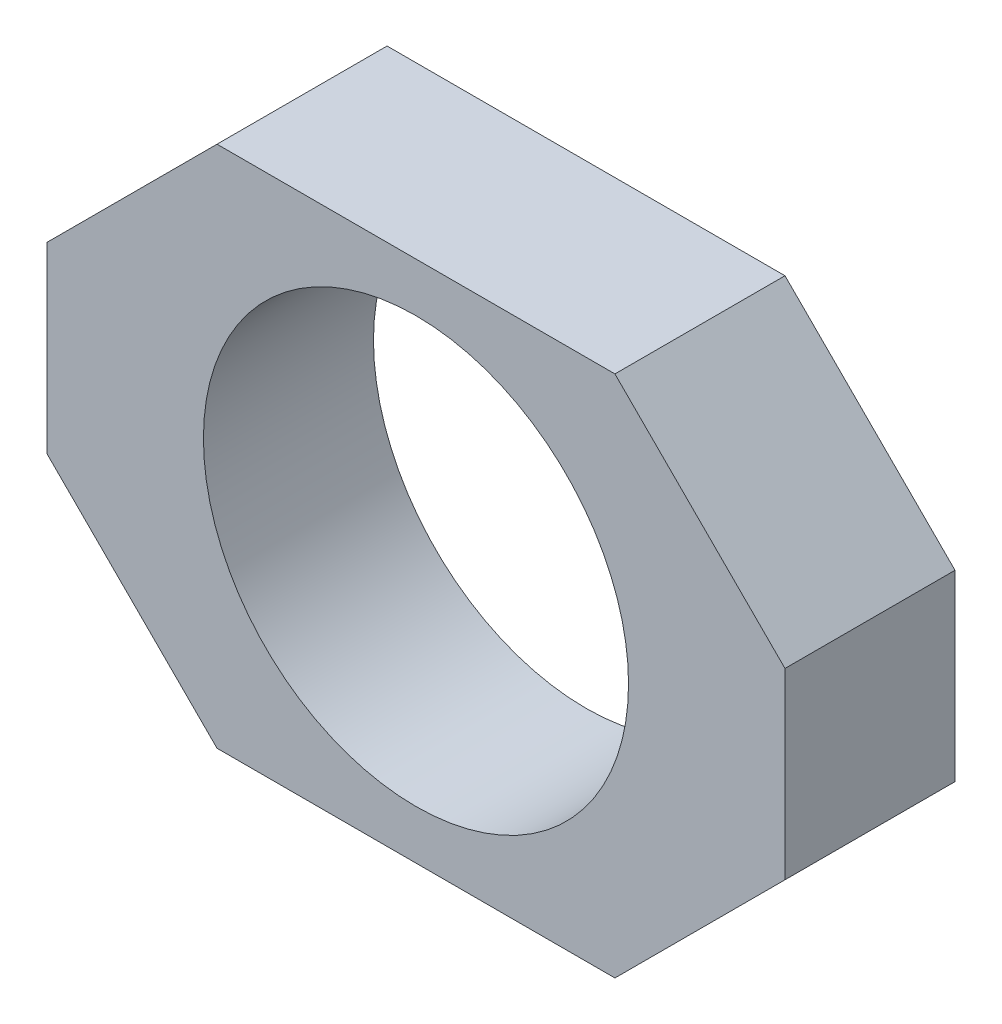
ISO-10303-21;
HEADER;
FILE_DESCRIPTION(('STEP AP214'),'2;1');
FILE_NAME('part.step','',(''),(''),'','','');
FILE_SCHEMA(('AUTOMOTIVE_DESIGN { 1 0 10303 214 1 1 1 1 }'));
ENDSEC;
DATA;
#1=APPLICATION_CONTEXT('core data for automotive mechanical design processes');
#2=APPLICATION_PROTOCOL_DEFINITION('international standard','automotive_design',2000,#1);
#3=PRODUCT_CONTEXT('',#1,'mechanical');
#4=PRODUCT('Part','Part','',(#3));
#5=PRODUCT_RELATED_PRODUCT_CATEGORY('part','',(#4));
#6=PRODUCT_DEFINITION_FORMATION('','',#4);
#7=PRODUCT_DEFINITION_CONTEXT('part definition',#1,'design');
#8=PRODUCT_DEFINITION('design','',#6,#7);
#9=PRODUCT_DEFINITION_SHAPE('','',#8);
#10=(LENGTH_UNIT() NAMED_UNIT(*) SI_UNIT(.MILLI.,.METRE.));
#11=(NAMED_UNIT(*) PLANE_ANGLE_UNIT() SI_UNIT($,.RADIAN.));
#12=(NAMED_UNIT(*) SI_UNIT($,.STERADIAN.) SOLID_ANGLE_UNIT());
#13=UNCERTAINTY_MEASURE_WITH_UNIT(LENGTH_MEASURE(1.E-05),#10,'distance_accuracy_value','');
#14=(GEOMETRIC_REPRESENTATION_CONTEXT(3) GLOBAL_UNCERTAINTY_ASSIGNED_CONTEXT((#13)) GLOBAL_UNIT_ASSIGNED_CONTEXT((#10,
#11,#12)) REPRESENTATION_CONTEXT('',''));
#15=CARTESIAN_POINT('',(0.,0.,0.));
#16=DIRECTION('',(0.,0.,1.));
#17=DIRECTION('',(1.,0.,0.));
#18=AXIS2_PLACEMENT_3D('',#15,#16,#17);
#19=CARTESIAN_POINT('',(55.1185201664401,-39.0725036048284,-25.4));
#20=DIRECTION('',(1.,0.,0.));
#21=DIRECTION('',(0.,0.,-1.));
#22=AXIS2_PLACEMENT_3D('',#19,#20,#21);
#23=PLANE('',#22);
#24=DIRECTION('',(0.,1.,0.));
#25=VECTOR('',#24,1.);
#26=CARTESIAN_POINT('',(55.1185201664401,-39.0725036048284,0.));
#27=LINE('',#26,#25);
#28=CARTESIAN_POINT('',(55.1185201664401,-13.6725036048283,0.));
#29=VERTEX_POINT('',#28);
#30=CARTESIAN_POINT('',(55.1185201664401,13.6725036048284,0.));
#31=VERTEX_POINT('',#30);
#32=EDGE_CURVE('E188',#29,#31,#27,.T.);
#33=ORIENTED_EDGE('',*,*,#32,.F.);
#34=DIRECTION('',(0.,0.,-1.));
#35=VECTOR('',#34,1.);
#36=CARTESIAN_POINT('',(55.1185201664401,-13.6725036048283,-25.4));
#37=LINE('',#36,#35);
#38=CARTESIAN_POINT('',(55.1185201664401,-13.6725036048283,-25.4));
#39=VERTEX_POINT('',#38);
#40=EDGE_CURVE('E177',#29,#39,#37,.T.);
#41=ORIENTED_EDGE('',*,*,#40,.T.);
#42=DIRECTION('',(0.,1.,0.));
#43=VECTOR('',#42,1.);
#44=CARTESIAN_POINT('',(55.1185201664401,-39.0725036048284,-25.4));
#45=LINE('',#44,#43);
#46=CARTESIAN_POINT('',(55.1185201664401,13.6725036048284,-25.4));
#47=VERTEX_POINT('',#46);
#48=EDGE_CURVE('E185',#39,#47,#45,.T.);
#49=ORIENTED_EDGE('',*,*,#48,.T.);
#50=DIRECTION('',(0.,0.,1.));
#51=VECTOR('',#50,1.);
#52=CARTESIAN_POINT('',(55.1185201664401,13.6725036048284,-25.4));
#53=LINE('',#52,#51);
#54=EDGE_CURVE('E173',#47,#31,#53,.T.);
#55=ORIENTED_EDGE('',*,*,#54,.T.);
#56=EDGE_LOOP('',(#33,#41,#49,#55));
#57=FACE_BOUND('',#56,.T.);
#58=ADVANCED_FACE('F46',(#57),#23,.T.);
#59=CARTESIAN_POINT('',(-55.1185201664401,-39.0725036048284,-25.4));
#60=DIRECTION('',(0.,-1.,0.));
#61=DIRECTION('',(0.,0.,-1.));
#62=AXIS2_PLACEMENT_3D('',#59,#60,#61);
#63=PLANE('',#62);
#64=DIRECTION('',(1.,0.,0.));
#65=VECTOR('',#64,1.);
#66=CARTESIAN_POINT('',(-55.1185201664401,-39.0725036048284,0.));
#67=LINE('',#66,#65);
#68=CARTESIAN_POINT('',(-29.7185201664399,-39.0725036048284,0.));
#69=VERTEX_POINT('',#68);
#70=CARTESIAN_POINT('',(29.71852016644,-39.0725036048284,0.));
#71=VERTEX_POINT('',#70);
#72=EDGE_CURVE('E134',#69,#71,#67,.T.);
#73=ORIENTED_EDGE('',*,*,#72,.F.);
#74=DIRECTION('',(0.,0.,-1.));
#75=VECTOR('',#74,1.);
#76=CARTESIAN_POINT('',(-29.7185201664399,-39.0725036048284,-25.4));
#77=LINE('',#76,#75);
#78=CARTESIAN_POINT('',(-29.7185201664399,-39.0725036048284,-25.4));
#79=VERTEX_POINT('',#78);
#80=EDGE_CURVE('E159',#69,#79,#77,.T.);
#81=ORIENTED_EDGE('',*,*,#80,.T.);
#82=DIRECTION('',(1.,0.,0.));
#83=VECTOR('',#82,1.);
#84=CARTESIAN_POINT('',(-55.1185201664401,-39.0725036048284,-25.4));
#85=LINE('',#84,#83);
#86=CARTESIAN_POINT('',(29.71852016644,-39.0725036048284,-25.4));
#87=VERTEX_POINT('',#86);
#88=EDGE_CURVE('E138',#79,#87,#85,.T.);
#89=ORIENTED_EDGE('',*,*,#88,.T.);
#90=DIRECTION('',(0.,0.,1.));
#91=VECTOR('',#90,1.);
#92=CARTESIAN_POINT('',(29.71852016644,-39.0725036048284,-25.4));
#93=LINE('',#92,#91);
#94=EDGE_CURVE('E155',#87,#71,#93,.T.);
#95=ORIENTED_EDGE('',*,*,#94,.T.);
#96=EDGE_LOOP('',(#73,#81,#89,#95));
#97=FACE_BOUND('',#96,.T.);
#98=ADVANCED_FACE('F202',(#97),#63,.T.);
#99=CARTESIAN_POINT('',(-55.1185201664401,-39.0725036048284,-25.4));
#100=DIRECTION('',(-1.,0.,0.));
#101=DIRECTION('',(0.,0.,1.));
#102=AXIS2_PLACEMENT_3D('',#99,#100,#101);
#103=PLANE('',#102);
#104=DIRECTION('',(0.,-1.,0.));
#105=VECTOR('',#104,1.);
#106=CARTESIAN_POINT('',(-55.1185201664401,-39.0725036048284,-25.4));
#107=LINE('',#106,#105);
#108=CARTESIAN_POINT('',(-55.1185201664401,13.6725036048283,-25.4));
#109=VERTEX_POINT('',#108);
#110=CARTESIAN_POINT('',(-55.1185201664401,-13.6725036048284,-25.4));
#111=VERTEX_POINT('',#110);
#112=EDGE_CURVE('E144',#109,#111,#107,.T.);
#113=ORIENTED_EDGE('',*,*,#112,.T.);
#114=DIRECTION('',(0.,0.,1.));
#115=VECTOR('',#114,1.);
#116=CARTESIAN_POINT('',(-55.1185201664401,-13.6725036048284,-25.4));
#117=LINE('',#116,#115);
#118=CARTESIAN_POINT('',(-55.1185201664401,-13.6725036048284,0.));
#119=VERTEX_POINT('',#118);
#120=EDGE_CURVE('E132',#111,#119,#117,.T.);
#121=ORIENTED_EDGE('',*,*,#120,.T.);
#122=DIRECTION('',(0.,-1.,0.));
#123=VECTOR('',#122,1.);
#124=CARTESIAN_POINT('',(-55.1185201664401,-39.0725036048284,0.));
#125=LINE('',#124,#123);
#126=CARTESIAN_POINT('',(-55.1185201664401,13.6725036048283,0.));
#127=VERTEX_POINT('',#126);
#128=EDGE_CURVE('E117',#127,#119,#125,.T.);
#129=ORIENTED_EDGE('',*,*,#128,.F.);
#130=DIRECTION('',(0.,0.,-1.));
#131=VECTOR('',#130,1.);
#132=CARTESIAN_POINT('',(-55.1185201664401,13.6725036048283,-25.4));
#133=LINE('',#132,#131);
#134=EDGE_CURVE('E130',#127,#109,#133,.T.);
#135=ORIENTED_EDGE('',*,*,#134,.T.);
#136=EDGE_LOOP('',(#113,#121,#129,#135));
#137=FACE_BOUND('',#136,.T.);
#138=ADVANCED_FACE('F129',(#137),#103,.T.);
#139=CARTESIAN_POINT('',(-55.1185201664401,39.0725036048284,-25.4));
#140=DIRECTION('',(0.,1.,0.));
#141=DIRECTION('',(0.,0.,1.));
#142=AXIS2_PLACEMENT_3D('',#139,#140,#141);
#143=PLANE('',#142);
#144=DIRECTION('',(-1.,0.,0.));
#145=VECTOR('',#144,1.);
#146=CARTESIAN_POINT('',(-55.1185201664401,39.0725036048284,-25.4));
#147=LINE('',#146,#145);
#148=CARTESIAN_POINT('',(29.7185201664399,39.0725036048284,-25.4));
#149=VERTEX_POINT('',#148);
#150=CARTESIAN_POINT('',(-29.71852016644,39.0725036048284,-25.4));
#151=VERTEX_POINT('',#150);
#152=EDGE_CURVE('E195',#149,#151,#147,.T.);
#153=ORIENTED_EDGE('',*,*,#152,.T.);
#154=DIRECTION('',(0.,0.,1.));
#155=VECTOR('',#154,1.);
#156=CARTESIAN_POINT('',(-29.71852016644,39.0725036048284,-25.4));
#157=LINE('',#156,#155);
#158=CARTESIAN_POINT('',(-29.71852016644,39.0725036048284,0.));
#159=VERTEX_POINT('',#158);
#160=EDGE_CURVE('E11',#151,#159,#157,.T.);
#161=ORIENTED_EDGE('',*,*,#160,.T.);
#162=DIRECTION('',(-1.,0.,0.));
#163=VECTOR('',#162,1.);
#164=CARTESIAN_POINT('',(-55.1185201664401,39.0725036048284,0.));
#165=LINE('',#164,#163);
#166=CARTESIAN_POINT('',(29.7185201664399,39.0725036048284,0.));
#167=VERTEX_POINT('',#166);
#168=EDGE_CURVE('E118',#167,#159,#165,.T.);
#169=ORIENTED_EDGE('',*,*,#168,.F.);
#170=DIRECTION('',(0.,0.,-1.));
#171=VECTOR('',#170,1.);
#172=CARTESIAN_POINT('',(29.7185201664399,39.0725036048284,-25.4));
#173=LINE('',#172,#171);
#174=EDGE_CURVE('E56',#167,#149,#173,.T.);
#175=ORIENTED_EDGE('',*,*,#174,.T.);
#176=EDGE_LOOP('',(#153,#161,#169,#175));
#177=FACE_BOUND('',#176,.T.);
#178=ADVANCED_FACE('F245',(#177),#143,.T.);
#179=CARTESIAN_POINT('',(0.,0.,-25.4));
#180=DIRECTION('',(0.,0.,-1.));
#181=DIRECTION('',(-1.,0.,0.));
#182=AXIS2_PLACEMENT_3D('',#179,#180,#181);
#183=PLANE('',#182);
#184=CARTESIAN_POINT('',(0.,0.,-25.4));
#185=DIRECTION('',(0.,0.,1.));
#186=DIRECTION('',(1.,0.,0.));
#187=AXIS2_PLACEMENT_3D('',#184,#185,#186);
#188=CIRCLE('',#187,31.75);
#189=CARTESIAN_POINT('',(31.75,0.,-25.4));
#190=VERTEX_POINT('',#189);
#191=EDGE_CURVE('E210',#190,#190,#188,.T.);
#192=ORIENTED_EDGE('',*,*,#191,.T.);
#193=EDGE_LOOP('',(#192));
#194=FACE_BOUND('',#193,.T.);
#195=ORIENTED_EDGE('',*,*,#88,.F.);
#196=DIRECTION('',(0.707106781186549,-0.707106781186546,0.));
#197=VECTOR('',#196,1.);
#198=CARTESIAN_POINT('',(-34.3955118856341,-34.3955118856343,-25.4));
#199=LINE('',#198,#197);
#200=EDGE_CURVE('E170',#79,#111,#199,.F.);
#201=ORIENTED_EDGE('',*,*,#200,.T.);
#202=ORIENTED_EDGE('',*,*,#112,.F.);
#203=DIRECTION('',(-0.707106781186546,-0.707106781186549,0.));
#204=VECTOR('',#203,1.);
#205=CARTESIAN_POINT('',(-34.3955118856343,34.3955118856342,-25.4));
#206=LINE('',#205,#204);
#207=EDGE_CURVE('E63',#109,#151,#206,.F.);
#208=ORIENTED_EDGE('',*,*,#207,.T.);
#209=ORIENTED_EDGE('',*,*,#152,.F.);
#210=DIRECTION('',(-0.707106781186549,0.707106781186546,0.));
#211=VECTOR('',#210,1.);
#212=CARTESIAN_POINT('',(34.3955118856341,34.3955118856343,-25.4));
#213=LINE('',#212,#211);
#214=EDGE_CURVE('E162',#149,#47,#213,.F.);
#215=ORIENTED_EDGE('',*,*,#214,.T.);
#216=ORIENTED_EDGE('',*,*,#48,.F.);
#217=DIRECTION('',(0.707106781186546,0.707106781186549,0.));
#218=VECTOR('',#217,1.);
#219=CARTESIAN_POINT('',(34.3955118856343,-34.3955118856342,-25.4));
#220=LINE('',#219,#218);
#221=EDGE_CURVE('E167',#39,#87,#220,.F.);
#222=ORIENTED_EDGE('',*,*,#221,.T.);
#223=EDGE_LOOP('',(#195,#201,#202,#208,#209,#215,#216,#222));
#224=FACE_BOUND('',#223,.T.);
#225=ADVANCED_FACE('F192',(#194,#224),#183,.T.);
#226=CARTESIAN_POINT('',(0.,0.,0.));
#227=DIRECTION('',(0.,0.,-1.));
#228=DIRECTION('',(-1.,0.,0.));
#229=AXIS2_PLACEMENT_3D('',#226,#227,#228);
#230=PLANE('',#229);
#231=CARTESIAN_POINT('',(0.,0.,0.));
#232=DIRECTION('',(0.,0.,1.));
#233=DIRECTION('',(1.,0.,0.));
#234=AXIS2_PLACEMENT_3D('',#231,#232,#233);
#235=CIRCLE('',#234,31.75);
#236=CARTESIAN_POINT('',(31.75,0.,0.));
#237=VERTEX_POINT('',#236);
#238=EDGE_CURVE('E214',#237,#237,#235,.T.);
#239=ORIENTED_EDGE('',*,*,#238,.F.);
#240=EDGE_LOOP('',(#239));
#241=FACE_BOUND('',#240,.T.);
#242=ORIENTED_EDGE('',*,*,#128,.T.);
#243=DIRECTION('',(-0.707106781186549,0.707106781186546,0.));
#244=VECTOR('',#243,1.);
#245=CARTESIAN_POINT('',(-55.1185201664401,-13.6725036048284,0.));
#246=LINE('',#245,#244);
#247=EDGE_CURVE('E152',#119,#69,#246,.F.);
#248=ORIENTED_EDGE('',*,*,#247,.T.);
#249=ORIENTED_EDGE('',*,*,#72,.T.);
#250=DIRECTION('',(-0.707106781186546,-0.707106781186549,0.));
#251=VECTOR('',#250,1.);
#252=CARTESIAN_POINT('',(29.71852016644,-39.0725036048284,0.));
#253=LINE('',#252,#251);
#254=EDGE_CURVE('E123',#71,#29,#253,.F.);
#255=ORIENTED_EDGE('',*,*,#254,.T.);
#256=ORIENTED_EDGE('',*,*,#32,.T.);
#257=DIRECTION('',(0.707106781186549,-0.707106781186546,0.));
#258=VECTOR('',#257,1.);
#259=CARTESIAN_POINT('',(55.1185201664401,13.6725036048284,0.));
#260=LINE('',#259,#258);
#261=EDGE_CURVE('E124',#31,#167,#260,.F.);
#262=ORIENTED_EDGE('',*,*,#261,.T.);
#263=ORIENTED_EDGE('',*,*,#168,.T.);
#264=DIRECTION('',(0.707106781186546,0.707106781186549,0.));
#265=VECTOR('',#264,1.);
#266=CARTESIAN_POINT('',(-29.71852016644,39.0725036048284,0.));
#267=LINE('',#266,#265);
#268=EDGE_CURVE('E114',#159,#127,#267,.F.);
#269=ORIENTED_EDGE('',*,*,#268,.T.);
#270=EDGE_LOOP('',(#242,#248,#249,#255,#256,#262,#263,#269));
#271=FACE_BOUND('',#270,.T.);
#272=ADVANCED_FACE('F116',(#241,#271),#230,.F.);
#273=CARTESIAN_POINT('',(0.,0.,-25.4));
#274=DIRECTION('',(0.,0.,1.));
#275=DIRECTION('',(1.,0.,0.));
#276=AXIS2_PLACEMENT_3D('',#273,#274,#275);
#277=CYLINDRICAL_SURFACE('',#276,31.75);
#278=ORIENTED_EDGE('',*,*,#191,.F.);
#279=EDGE_LOOP('',(#278));
#280=FACE_BOUND('',#279,.T.);
#281=ORIENTED_EDGE('',*,*,#238,.T.);
#282=EDGE_LOOP('',(#281));
#283=FACE_BOUND('',#282,.T.);
#284=ADVANCED_FACE('F227',(#280,#283),#277,.F.);
#285=CARTESIAN_POINT('',(-55.1185201664401,-13.6725036048284,-25.4));
#286=DIRECTION('',(0.707106781186546,0.707106781186549,0.));
#287=DIRECTION('',(0.,0.,1.));
#288=AXIS2_PLACEMENT_3D('',#285,#286,#287);
#289=PLANE('',#288);
#290=ORIENTED_EDGE('',*,*,#200,.F.);
#291=ORIENTED_EDGE('',*,*,#80,.F.);
#292=ORIENTED_EDGE('',*,*,#247,.F.);
#293=ORIENTED_EDGE('',*,*,#120,.F.);
#294=EDGE_LOOP('',(#290,#291,#292,#293));
#295=FACE_BOUND('',#294,.T.);
#296=ADVANCED_FACE('F225',(#295),#289,.F.);
#297=CARTESIAN_POINT('',(29.71852016644,-39.0725036048284,-25.4));
#298=DIRECTION('',(-0.707106781186549,0.707106781186546,0.));
#299=DIRECTION('',(0.,0.,1.));
#300=AXIS2_PLACEMENT_3D('',#297,#298,#299);
#301=PLANE('',#300);
#302=ORIENTED_EDGE('',*,*,#221,.F.);
#303=ORIENTED_EDGE('',*,*,#40,.F.);
#304=ORIENTED_EDGE('',*,*,#254,.F.);
#305=ORIENTED_EDGE('',*,*,#94,.F.);
#306=EDGE_LOOP('',(#302,#303,#304,#305));
#307=FACE_BOUND('',#306,.T.);
#308=ADVANCED_FACE('F198',(#307),#301,.F.);
#309=CARTESIAN_POINT('',(-29.71852016644,39.0725036048284,-25.4));
#310=DIRECTION('',(0.707106781186549,-0.707106781186546,0.));
#311=DIRECTION('',(0.,0.,1.));
#312=AXIS2_PLACEMENT_3D('',#309,#310,#311);
#313=PLANE('',#312);
#314=ORIENTED_EDGE('',*,*,#207,.F.);
#315=ORIENTED_EDGE('',*,*,#134,.F.);
#316=ORIENTED_EDGE('',*,*,#268,.F.);
#317=ORIENTED_EDGE('',*,*,#160,.F.);
#318=EDGE_LOOP('',(#314,#315,#316,#317));
#319=FACE_BOUND('',#318,.T.);
#320=ADVANCED_FACE('F136',(#319),#313,.F.);
#321=CARTESIAN_POINT('',(55.1185201664401,13.6725036048284,-25.4));
#322=DIRECTION('',(-0.707106781186546,-0.707106781186549,0.));
#323=DIRECTION('',(0.,0.,1.));
#324=AXIS2_PLACEMENT_3D('',#321,#322,#323);
#325=PLANE('',#324);
#326=ORIENTED_EDGE('',*,*,#214,.F.);
#327=ORIENTED_EDGE('',*,*,#174,.F.);
#328=ORIENTED_EDGE('',*,*,#261,.F.);
#329=ORIENTED_EDGE('',*,*,#54,.F.);
#330=EDGE_LOOP('',(#326,#327,#328,#329));
#331=FACE_BOUND('',#330,.T.);
#332=ADVANCED_FACE('F49',(#331),#325,.F.);
#333=CLOSED_SHELL('',(#58,#98,#138,#178,#225,#272,#284,#296,#308,#320,#332));
#334=MANIFOLD_SOLID_BREP('B2',#333);
#335=ADVANCED_BREP_SHAPE_REPRESENTATION('',(#18,#334),#14);
#336=SHAPE_DEFINITION_REPRESENTATION(#9,#335);
ENDSEC;
END-ISO-10303-21;
